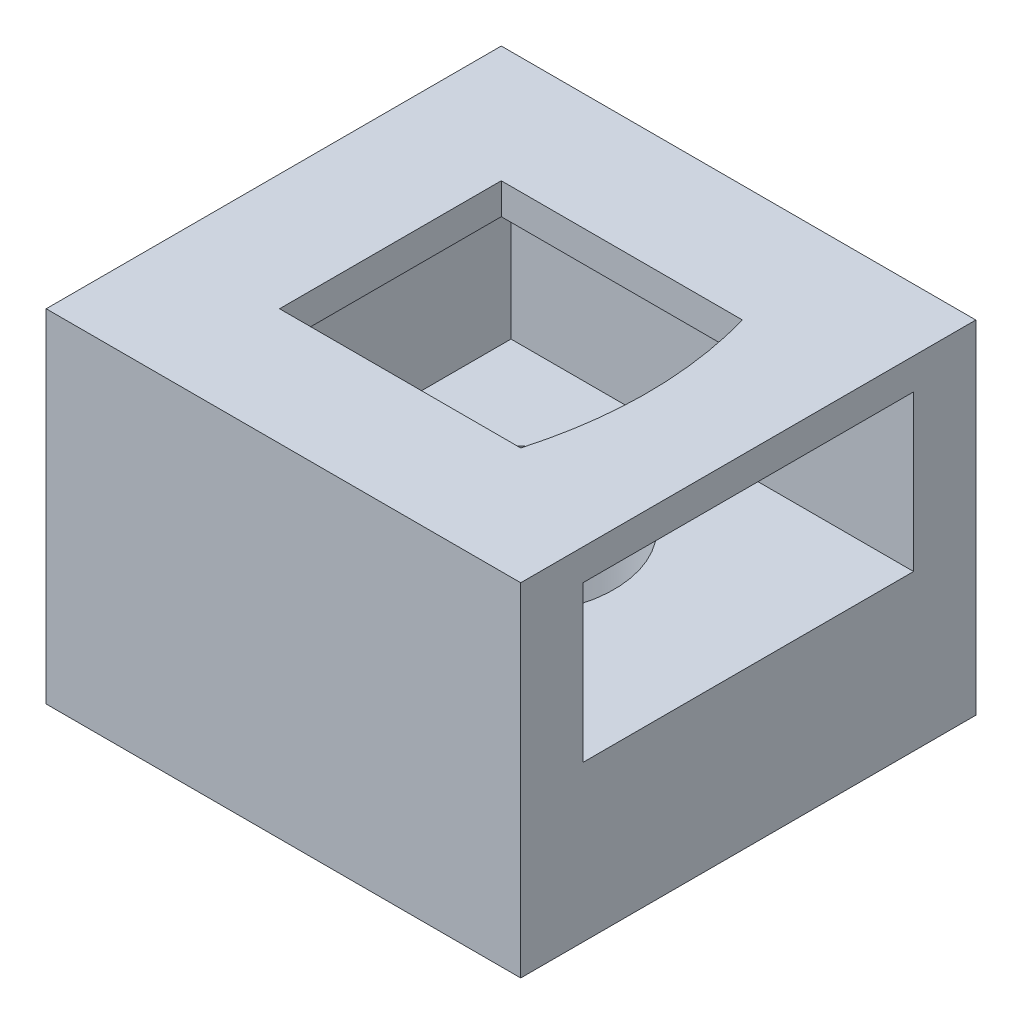
ISO-10303-21;
HEADER;
FILE_DESCRIPTION(('STEP AP214'),'2;1');
FILE_NAME('part.step','',(''),(''),'','','');
FILE_SCHEMA(('AUTOMOTIVE_DESIGN { 1 0 10303 214 1 1 1 1 }'));
ENDSEC;
DATA;
#1=APPLICATION_CONTEXT('core data for automotive mechanical design processes');
#2=APPLICATION_PROTOCOL_DEFINITION('international standard','automotive_design',2000,#1);
#3=PRODUCT_CONTEXT('',#1,'mechanical');
#4=PRODUCT('Part','Part','',(#3));
#5=PRODUCT_RELATED_PRODUCT_CATEGORY('part','',(#4));
#6=PRODUCT_DEFINITION_FORMATION('','',#4);
#7=PRODUCT_DEFINITION_CONTEXT('part definition',#1,'design');
#8=PRODUCT_DEFINITION('design','',#6,#7);
#9=PRODUCT_DEFINITION_SHAPE('','',#8);
#10=(LENGTH_UNIT() NAMED_UNIT(*) SI_UNIT(.MILLI.,.METRE.));
#11=(NAMED_UNIT(*) PLANE_ANGLE_UNIT() SI_UNIT($,.RADIAN.));
#12=(NAMED_UNIT(*) SI_UNIT($,.STERADIAN.) SOLID_ANGLE_UNIT());
#13=UNCERTAINTY_MEASURE_WITH_UNIT(LENGTH_MEASURE(1.E-05),#10,'distance_accuracy_value','');
#14=(GEOMETRIC_REPRESENTATION_CONTEXT(3) GLOBAL_UNCERTAINTY_ASSIGNED_CONTEXT((#13)) GLOBAL_UNIT_ASSIGNED_CONTEXT((#10,
#11,#12)) REPRESENTATION_CONTEXT('',''));
#15=CARTESIAN_POINT('',(0.,0.,0.));
#16=DIRECTION('',(0.,0.,1.));
#17=DIRECTION('',(1.,0.,0.));
#18=AXIS2_PLACEMENT_3D('',#15,#16,#17);
#19=CARTESIAN_POINT('',(0.,-0.8,-2.85));
#20=DIRECTION('',(0.,0.,1.));
#21=DIRECTION('',(1.,0.,0.));
#22=AXIS2_PLACEMENT_3D('',#19,#20,#21);
#23=PLANE('',#22);
#24=DIRECTION('',(1.,0.,0.));
#25=VECTOR('',#24,1.);
#26=CARTESIAN_POINT('',(0.,0.,-2.85));
#27=LINE('',#26,#25);
#28=CARTESIAN_POINT('',(-3.1,0.,-2.85));
#29=VERTEX_POINT('',#28);
#30=CARTESIAN_POINT('',(3.1,0.,-2.85));
#31=VERTEX_POINT('',#30);
#32=EDGE_CURVE('E174',#29,#31,#27,.T.);
#33=ORIENTED_EDGE('',*,*,#32,.F.);
#34=DIRECTION('',(0.,1.,0.));
#35=VECTOR('',#34,1.);
#36=CARTESIAN_POINT('',(-3.1,-0.8,-2.85));
#37=LINE('',#36,#35);
#38=CARTESIAN_POINT('',(-3.1,-0.8,-2.85));
#39=VERTEX_POINT('',#38);
#40=EDGE_CURVE('E179',#39,#29,#37,.T.);
#41=ORIENTED_EDGE('',*,*,#40,.F.);
#42=DIRECTION('',(1.,0.,0.));
#43=VECTOR('',#42,1.);
#44=CARTESIAN_POINT('',(0.,-0.8,-2.85));
#45=LINE('',#44,#43);
#46=CARTESIAN_POINT('',(3.1,-0.8,-2.85));
#47=VERTEX_POINT('',#46);
#48=EDGE_CURVE('E176',#39,#47,#45,.T.);
#49=ORIENTED_EDGE('',*,*,#48,.T.);
#50=DIRECTION('',(0.,1.,0.));
#51=VECTOR('',#50,1.);
#52=CARTESIAN_POINT('',(3.1,-0.8,-2.85));
#53=LINE('',#52,#51);
#54=EDGE_CURVE('E160',#47,#31,#53,.T.);
#55=ORIENTED_EDGE('',*,*,#54,.T.);
#56=EDGE_LOOP('',(#33,#41,#49,#55));
#57=FACE_BOUND('',#56,.T.);
#58=ADVANCED_FACE('F47',(#57),#23,.T.);
#59=CARTESIAN_POINT('',(-3.1,-0.8,0.));
#60=DIRECTION('',(1.,0.,0.));
#61=DIRECTION('',(0.,0.,-1.));
#62=AXIS2_PLACEMENT_3D('',#59,#60,#61);
#63=PLANE('',#62);
#64=DIRECTION('',(0.,0.,-1.));
#65=VECTOR('',#64,1.);
#66=CARTESIAN_POINT('',(-3.1,0.,0.));
#67=LINE('',#66,#65);
#68=CARTESIAN_POINT('',(-3.1,0.,2.85));
#69=VERTEX_POINT('',#68);
#70=EDGE_CURVE('E185',#69,#29,#67,.T.);
#71=ORIENTED_EDGE('',*,*,#70,.F.);
#72=DIRECTION('',(0.,1.,0.));
#73=VECTOR('',#72,1.);
#74=CARTESIAN_POINT('',(-3.1,-0.8,2.85));
#75=LINE('',#74,#73);
#76=CARTESIAN_POINT('',(-3.1,-0.8,2.85));
#77=VERTEX_POINT('',#76);
#78=EDGE_CURVE('E200',#77,#69,#75,.T.);
#79=ORIENTED_EDGE('',*,*,#78,.F.);
#80=DIRECTION('',(0.,0.,-1.));
#81=VECTOR('',#80,1.);
#82=CARTESIAN_POINT('',(-3.1,-0.8,0.));
#83=LINE('',#82,#81);
#84=EDGE_CURVE('E192',#77,#39,#83,.T.);
#85=ORIENTED_EDGE('',*,*,#84,.T.);
#86=ORIENTED_EDGE('',*,*,#40,.T.);
#87=EDGE_LOOP('',(#71,#79,#85,#86));
#88=FACE_BOUND('',#87,.T.);
#89=ADVANCED_FACE('F261',(#88),#63,.T.);
#90=CARTESIAN_POINT('',(6.1,-0.8,0.));
#91=DIRECTION('',(-1.,0.,0.));
#92=DIRECTION('',(0.,0.,1.));
#93=AXIS2_PLACEMENT_3D('',#90,#91,#92);
#94=PLANE('',#93);
#95=DIRECTION('',(0.,0.,-1.));
#96=VECTOR('',#95,1.);
#97=CARTESIAN_POINT('',(6.1,-0.8,0.));
#98=LINE('',#97,#96);
#99=CARTESIAN_POINT('',(6.1,-0.8,4.25));
#100=VERTEX_POINT('',#99);
#101=CARTESIAN_POINT('',(6.1,-0.8,-4.25));
#102=VERTEX_POINT('',#101);
#103=EDGE_CURVE('E57',#100,#102,#98,.T.);
#104=ORIENTED_EDGE('',*,*,#103,.T.);
#105=DIRECTION('',(0.,-1.,0.));
#106=VECTOR('',#105,1.);
#107=CARTESIAN_POINT('',(6.1,-0.800000000000001,-4.25));
#108=LINE('',#107,#106);
#109=CARTESIAN_POINT('',(6.1,-4.8,-4.25));
#110=VERTEX_POINT('',#109);
#111=EDGE_CURVE('E11',#102,#110,#108,.T.);
#112=ORIENTED_EDGE('',*,*,#111,.T.);
#113=DIRECTION('',(0.,0.,1.));
#114=VECTOR('',#113,1.);
#115=CARTESIAN_POINT('',(6.1,-4.8,0.));
#116=LINE('',#115,#114);
#117=CARTESIAN_POINT('',(6.1,-4.8,4.25));
#118=VERTEX_POINT('',#117);
#119=EDGE_CURVE('E178',#110,#118,#116,.T.);
#120=ORIENTED_EDGE('',*,*,#119,.T.);
#121=DIRECTION('',(0.,1.,0.));
#122=VECTOR('',#121,1.);
#123=CARTESIAN_POINT('',(6.1,-0.799999999999999,4.25));
#124=LINE('',#123,#122);
#125=EDGE_CURVE('E219',#118,#100,#124,.T.);
#126=ORIENTED_EDGE('',*,*,#125,.T.);
#127=EDGE_LOOP('',(#104,#112,#120,#126));
#128=FACE_BOUND('',#127,.T.);
#129=DIRECTION('',(0.,0.,1.));
#130=VECTOR('',#129,1.);
#131=CARTESIAN_POINT('',(6.1,0.,0.));
#132=LINE('',#131,#130);
#133=CARTESIAN_POINT('',(6.1,0.,-5.85));
#134=VERTEX_POINT('',#133);
#135=CARTESIAN_POINT('',(6.1,0.,5.85));
#136=VERTEX_POINT('',#135);
#137=EDGE_CURVE('E243',#134,#136,#132,.T.);
#138=ORIENTED_EDGE('',*,*,#137,.T.);
#139=DIRECTION('',(0.,1.,0.));
#140=VECTOR('',#139,1.);
#141=CARTESIAN_POINT('',(6.1,-0.8,5.85));
#142=LINE('',#141,#140);
#143=CARTESIAN_POINT('',(6.1,-8.8,5.85));
#144=VERTEX_POINT('',#143);
#145=EDGE_CURVE('E203',#144,#136,#142,.T.);
#146=ORIENTED_EDGE('',*,*,#145,.F.);
#147=DIRECTION('',(0.,0.,1.));
#148=VECTOR('',#147,1.);
#149=CARTESIAN_POINT('',(6.1,-8.8,5.85));
#150=LINE('',#149,#148);
#151=CARTESIAN_POINT('',(6.1,-8.8,-5.85));
#152=VERTEX_POINT('',#151);
#153=EDGE_CURVE('E313',#152,#144,#150,.T.);
#154=ORIENTED_EDGE('',*,*,#153,.F.);
#155=DIRECTION('',(0.,1.,0.));
#156=VECTOR('',#155,1.);
#157=CARTESIAN_POINT('',(6.1,-0.8,-5.85));
#158=LINE('',#157,#156);
#159=EDGE_CURVE('E212',#152,#134,#158,.T.);
#160=ORIENTED_EDGE('',*,*,#159,.T.);
#161=EDGE_LOOP('',(#138,#146,#154,#160));
#162=FACE_BOUND('',#161,.T.);
#163=ADVANCED_FACE('F49',(#128,#162),#94,.F.);
#164=CARTESIAN_POINT('',(0.,-0.8,5.85));
#165=DIRECTION('',(0.,0.,1.));
#166=DIRECTION('',(1.,0.,0.));
#167=AXIS2_PLACEMENT_3D('',#164,#165,#166);
#168=PLANE('',#167);
#169=DIRECTION('',(1.,0.,0.));
#170=VECTOR('',#169,1.);
#171=CARTESIAN_POINT('',(0.,0.,5.85));
#172=LINE('',#171,#170);
#173=CARTESIAN_POINT('',(-6.1,0.,5.85));
#174=VERTEX_POINT('',#173);
#175=EDGE_CURVE('E254',#174,#136,#172,.T.);
#176=ORIENTED_EDGE('',*,*,#175,.F.);
#177=DIRECTION('',(0.,1.,0.));
#178=VECTOR('',#177,1.);
#179=CARTESIAN_POINT('',(-6.1,-0.8,5.85));
#180=LINE('',#179,#178);
#181=CARTESIAN_POINT('',(-6.1,-8.8,5.85));
#182=VERTEX_POINT('',#181);
#183=EDGE_CURVE('E206',#182,#174,#180,.T.);
#184=ORIENTED_EDGE('',*,*,#183,.F.);
#185=DIRECTION('',(-1.,0.,0.));
#186=VECTOR('',#185,1.);
#187=CARTESIAN_POINT('',(-6.1,-8.8,5.85));
#188=LINE('',#187,#186);
#189=EDGE_CURVE('E320',#144,#182,#188,.T.);
#190=ORIENTED_EDGE('',*,*,#189,.F.);
#191=ORIENTED_EDGE('',*,*,#145,.T.);
#192=EDGE_LOOP('',(#176,#184,#190,#191));
#193=FACE_BOUND('',#192,.T.);
#194=ADVANCED_FACE('F393',(#193),#168,.T.);
#195=CARTESIAN_POINT('',(-6.1,-0.8,0.));
#196=DIRECTION('',(-1.,0.,0.));
#197=DIRECTION('',(0.,0.,1.));
#198=AXIS2_PLACEMENT_3D('',#195,#196,#197);
#199=PLANE('',#198);
#200=DIRECTION('',(0.,0.,1.));
#201=VECTOR('',#200,1.);
#202=CARTESIAN_POINT('',(-6.1,0.,0.));
#203=LINE('',#202,#201);
#204=CARTESIAN_POINT('',(-6.1,0.,-5.85));
#205=VERTEX_POINT('',#204);
#206=EDGE_CURVE('E250',#205,#174,#203,.T.);
#207=ORIENTED_EDGE('',*,*,#206,.F.);
#208=DIRECTION('',(0.,1.,0.));
#209=VECTOR('',#208,1.);
#210=CARTESIAN_POINT('',(-6.1,-0.8,-5.85));
#211=LINE('',#210,#209);
#212=CARTESIAN_POINT('',(-6.1,-15.02,-5.85));
#213=VERTEX_POINT('',#212);
#214=EDGE_CURVE('E209',#213,#205,#211,.T.);
#215=ORIENTED_EDGE('',*,*,#214,.F.);
#216=DIRECTION('',(0.,0.,-1.));
#217=VECTOR('',#216,1.);
#218=CARTESIAN_POINT('',(-6.1,-15.02,-5.85));
#219=LINE('',#218,#217);
#220=CARTESIAN_POINT('',(-6.1,-15.02,-3.35));
#221=VERTEX_POINT('',#220);
#222=EDGE_CURVE('E277',#221,#213,#219,.T.);
#223=ORIENTED_EDGE('',*,*,#222,.F.);
#224=DIRECTION('',(0.,1.,0.));
#225=VECTOR('',#224,1.);
#226=CARTESIAN_POINT('',(-6.1,-15.02,-3.35));
#227=LINE('',#226,#225);
#228=CARTESIAN_POINT('',(-6.1,-8.8,-3.35));
#229=VERTEX_POINT('',#228);
#230=EDGE_CURVE('E292',#221,#229,#227,.T.);
#231=ORIENTED_EDGE('',*,*,#230,.T.);
#232=DIRECTION('',(0.,0.,-1.));
#233=VECTOR('',#232,1.);
#234=CARTESIAN_POINT('',(-6.1,-8.8,5.85));
#235=LINE('',#234,#233);
#236=EDGE_CURVE('E324',#182,#229,#235,.T.);
#237=ORIENTED_EDGE('',*,*,#236,.F.);
#238=ORIENTED_EDGE('',*,*,#183,.T.);
#239=EDGE_LOOP('',(#207,#215,#223,#231,#237,#238));
#240=FACE_BOUND('',#239,.T.);
#241=ADVANCED_FACE('F396',(#240),#199,.T.);
#242=CARTESIAN_POINT('',(0.,-0.8,-5.85));
#243=DIRECTION('',(0.,0.,1.));
#244=DIRECTION('',(1.,0.,0.));
#245=AXIS2_PLACEMENT_3D('',#242,#243,#244);
#246=PLANE('',#245);
#247=DIRECTION('',(1.,0.,0.));
#248=VECTOR('',#247,1.);
#249=CARTESIAN_POINT('',(0.,0.,-5.85));
#250=LINE('',#249,#248);
#251=EDGE_CURVE('E247',#205,#134,#250,.T.);
#252=ORIENTED_EDGE('',*,*,#251,.T.);
#253=ORIENTED_EDGE('',*,*,#159,.F.);
#254=DIRECTION('',(1.,0.,0.));
#255=VECTOR('',#254,1.);
#256=CARTESIAN_POINT('',(-6.1,-8.8,-5.85));
#257=LINE('',#256,#255);
#258=CARTESIAN_POINT('',(-3.6,-8.8,-5.85));
#259=VERTEX_POINT('',#258);
#260=EDGE_CURVE('E327',#259,#152,#257,.T.);
#261=ORIENTED_EDGE('',*,*,#260,.F.);
#262=DIRECTION('',(0.,1.,0.));
#263=VECTOR('',#262,1.);
#264=CARTESIAN_POINT('',(-3.6,-15.02,-5.85));
#265=LINE('',#264,#263);
#266=CARTESIAN_POINT('',(-3.6,-15.02,-5.85));
#267=VERTEX_POINT('',#266);
#268=EDGE_CURVE('E304',#267,#259,#265,.T.);
#269=ORIENTED_EDGE('',*,*,#268,.F.);
#270=DIRECTION('',(1.,0.,0.));
#271=VECTOR('',#270,1.);
#272=CARTESIAN_POINT('',(-6.1,-15.02,-5.85));
#273=LINE('',#272,#271);
#274=EDGE_CURVE('E284',#213,#267,#273,.T.);
#275=ORIENTED_EDGE('',*,*,#274,.F.);
#276=ORIENTED_EDGE('',*,*,#214,.T.);
#277=EDGE_LOOP('',(#252,#253,#261,#269,#275,#276));
#278=FACE_BOUND('',#277,.T.);
#279=ADVANCED_FACE('F392',(#278),#246,.F.);
#280=CARTESIAN_POINT('',(0.,-0.8,2.85));
#281=DIRECTION('',(0.,0.,1.));
#282=DIRECTION('',(1.,0.,0.));
#283=AXIS2_PLACEMENT_3D('',#280,#281,#282);
#284=PLANE('',#283);
#285=DIRECTION('',(1.,0.,0.));
#286=VECTOR('',#285,1.);
#287=CARTESIAN_POINT('',(0.,0.,2.85));
#288=LINE('',#287,#286);
#289=CARTESIAN_POINT('',(3.1,0.,2.85));
#290=VERTEX_POINT('',#289);
#291=EDGE_CURVE('E194',#69,#290,#288,.T.);
#292=ORIENTED_EDGE('',*,*,#291,.T.);
#293=DIRECTION('',(0.,1.,0.));
#294=VECTOR('',#293,1.);
#295=CARTESIAN_POINT('',(3.1,-0.8,2.85));
#296=LINE('',#295,#294);
#297=CARTESIAN_POINT('',(3.1,-0.8,2.85));
#298=VERTEX_POINT('',#297);
#299=EDGE_CURVE('E163',#298,#290,#296,.T.);
#300=ORIENTED_EDGE('',*,*,#299,.F.);
#301=DIRECTION('',(1.,0.,0.));
#302=VECTOR('',#301,1.);
#303=CARTESIAN_POINT('',(0.,-0.8,2.85));
#304=LINE('',#303,#302);
#305=EDGE_CURVE('E187',#77,#298,#304,.T.);
#306=ORIENTED_EDGE('',*,*,#305,.F.);
#307=ORIENTED_EDGE('',*,*,#78,.T.);
#308=EDGE_LOOP('',(#292,#300,#306,#307));
#309=FACE_BOUND('',#308,.T.);
#310=ADVANCED_FACE('F259',(#309),#284,.F.);
#311=CARTESIAN_POINT('',(0.,-0.8,0.));
#312=DIRECTION('',(0.,1.,0.));
#313=DIRECTION('',(0.,0.,1.));
#314=AXIS2_PLACEMENT_3D('',#311,#312,#313);
#315=PLANE('',#314);
#316=DIRECTION('',(1.,0.,0.));
#317=VECTOR('',#316,1.);
#318=CARTESIAN_POINT('',(-4.25,-0.8,-4.25));
#319=LINE('',#318,#317);
#320=CARTESIAN_POINT('',(-4.25,-0.8,-4.25));
#321=VERTEX_POINT('',#320);
#322=EDGE_CURVE('E334',#321,#102,#319,.T.);
#323=ORIENTED_EDGE('',*,*,#322,.T.);
#324=ORIENTED_EDGE('',*,*,#103,.F.);
#325=DIRECTION('',(-1.,0.,0.));
#326=VECTOR('',#325,1.);
#327=CARTESIAN_POINT('',(-4.25,-0.8,4.25));
#328=LINE('',#327,#326);
#329=CARTESIAN_POINT('',(-4.25,-0.8,4.25));
#330=VERTEX_POINT('',#329);
#331=EDGE_CURVE('E330',#100,#330,#328,.T.);
#332=ORIENTED_EDGE('',*,*,#331,.T.);
#333=DIRECTION('',(0.,0.,-1.));
#334=VECTOR('',#333,1.);
#335=CARTESIAN_POINT('',(-4.25,-0.8,4.25));
#336=LINE('',#335,#334);
#337=EDGE_CURVE('E345',#330,#321,#336,.T.);
#338=ORIENTED_EDGE('',*,*,#337,.T.);
#339=EDGE_LOOP('',(#323,#324,#332,#338));
#340=FACE_BOUND('',#339,.T.);
#341=ORIENTED_EDGE('',*,*,#305,.T.);
#342=CARTESIAN_POINT('',(3.1,-0.8,2.85));
#343=CARTESIAN_POINT('',(3.9,-0.8,0.));
#344=CARTESIAN_POINT('',(3.1,-0.8,-2.85));
#345=B_SPLINE_CURVE_WITH_KNOTS('',2,(#342,#343,#344),.UNSPECIFIED.,.F.,.F.,(3,3),(0.,1.),.UNSPECIFIED.);
#346=EDGE_CURVE('E169',#298,#47,#345,.T.);
#347=ORIENTED_EDGE('',*,*,#346,.T.);
#348=ORIENTED_EDGE('',*,*,#48,.F.);
#349=ORIENTED_EDGE('',*,*,#84,.F.);
#350=EDGE_LOOP('',(#341,#347,#348,#349));
#351=FACE_BOUND('',#350,.T.);
#352=ADVANCED_FACE('F263',(#340,#351),#315,.F.);
#353=CARTESIAN_POINT('',(0.,0.,0.));
#354=DIRECTION('',(0.,1.,0.));
#355=DIRECTION('',(0.,0.,1.));
#356=AXIS2_PLACEMENT_3D('',#353,#354,#355);
#357=PLANE('',#356);
#358=CARTESIAN_POINT('',(3.1,0.,2.85));
#359=CARTESIAN_POINT('',(3.9,0.,0.));
#360=CARTESIAN_POINT('',(3.1,0.,-2.85));
#361=B_SPLINE_CURVE_WITH_KNOTS('',2,(#358,#359,#360),.UNSPECIFIED.,.F.,.F.,(3,3),(0.,1.),.UNSPECIFIED.);
#362=EDGE_CURVE('E157',#290,#31,#361,.T.);
#363=ORIENTED_EDGE('',*,*,#362,.F.);
#364=ORIENTED_EDGE('',*,*,#291,.F.);
#365=ORIENTED_EDGE('',*,*,#70,.T.);
#366=ORIENTED_EDGE('',*,*,#32,.T.);
#367=EDGE_LOOP('',(#363,#364,#365,#366));
#368=FACE_BOUND('',#367,.T.);
#369=ORIENTED_EDGE('',*,*,#137,.F.);
#370=ORIENTED_EDGE('',*,*,#251,.F.);
#371=ORIENTED_EDGE('',*,*,#206,.T.);
#372=ORIENTED_EDGE('',*,*,#175,.T.);
#373=EDGE_LOOP('',(#369,#370,#371,#372));
#374=FACE_BOUND('',#373,.T.);
#375=ADVANCED_FACE('F182',(#368,#374),#357,.T.);
#376=CARTESIAN_POINT('',(-4.25,-4.8,4.25));
#377=DIRECTION('',(0.,0.,-1.));
#378=DIRECTION('',(-1.,0.,0.));
#379=AXIS2_PLACEMENT_3D('',#376,#377,#378);
#380=PLANE('',#379);
#381=ORIENTED_EDGE('',*,*,#331,.F.);
#382=ORIENTED_EDGE('',*,*,#125,.F.);
#383=DIRECTION('',(-1.,0.,0.));
#384=VECTOR('',#383,1.);
#385=CARTESIAN_POINT('',(-4.25,-4.8,4.25));
#386=LINE('',#385,#384);
#387=CARTESIAN_POINT('',(-4.25,-4.8,4.25));
#388=VERTEX_POINT('',#387);
#389=EDGE_CURVE('E65',#118,#388,#386,.T.);
#390=ORIENTED_EDGE('',*,*,#389,.T.);
#391=DIRECTION('',(0.,1.,0.));
#392=VECTOR('',#391,1.);
#393=CARTESIAN_POINT('',(-4.25,-4.8,4.25));
#394=LINE('',#393,#392);
#395=EDGE_CURVE('E241',#388,#330,#394,.T.);
#396=ORIENTED_EDGE('',*,*,#395,.T.);
#397=EDGE_LOOP('',(#381,#382,#390,#396));
#398=FACE_BOUND('',#397,.T.);
#399=ADVANCED_FACE('F358',(#398),#380,.T.);
#400=CARTESIAN_POINT('',(-4.25,-4.8,4.25));
#401=DIRECTION('',(1.,0.,0.));
#402=DIRECTION('',(0.,0.,-1.));
#403=AXIS2_PLACEMENT_3D('',#400,#401,#402);
#404=PLANE('',#403);
#405=ORIENTED_EDGE('',*,*,#337,.F.);
#406=ORIENTED_EDGE('',*,*,#395,.F.);
#407=DIRECTION('',(0.,0.,-1.));
#408=VECTOR('',#407,1.);
#409=CARTESIAN_POINT('',(-4.25,-4.8,4.25));
#410=LINE('',#409,#408);
#411=CARTESIAN_POINT('',(-4.25,-4.8,-4.25));
#412=VERTEX_POINT('',#411);
#413=EDGE_CURVE('E333',#388,#412,#410,.T.);
#414=ORIENTED_EDGE('',*,*,#413,.T.);
#415=DIRECTION('',(0.,1.,0.));
#416=VECTOR('',#415,1.);
#417=CARTESIAN_POINT('',(-4.25,-4.8,-4.25));
#418=LINE('',#417,#416);
#419=EDGE_CURVE('E341',#412,#321,#418,.T.);
#420=ORIENTED_EDGE('',*,*,#419,.T.);
#421=EDGE_LOOP('',(#405,#406,#414,#420));
#422=FACE_BOUND('',#421,.T.);
#423=ADVANCED_FACE('F360',(#422),#404,.T.);
#424=CARTESIAN_POINT('',(-4.25,-4.8,-4.25));
#425=DIRECTION('',(0.,0.,1.));
#426=DIRECTION('',(1.,0.,0.));
#427=AXIS2_PLACEMENT_3D('',#424,#425,#426);
#428=PLANE('',#427);
#429=ORIENTED_EDGE('',*,*,#322,.F.);
#430=ORIENTED_EDGE('',*,*,#419,.F.);
#431=DIRECTION('',(1.,0.,0.));
#432=VECTOR('',#431,1.);
#433=CARTESIAN_POINT('',(-4.25,-4.8,-4.25));
#434=LINE('',#433,#432);
#435=EDGE_CURVE('E338',#412,#110,#434,.T.);
#436=ORIENTED_EDGE('',*,*,#435,.T.);
#437=ORIENTED_EDGE('',*,*,#111,.F.);
#438=EDGE_LOOP('',(#429,#430,#436,#437));
#439=FACE_BOUND('',#438,.T.);
#440=ADVANCED_FACE('F368',(#439),#428,.T.);
#441=CARTESIAN_POINT('',(0.,-8.8,0.));
#442=DIRECTION('',(0.,-1.,0.));
#443=DIRECTION('',(0.,0.,-1.));
#444=AXIS2_PLACEMENT_3D('',#441,#442,#443);
#445=PLANE('',#444);
#446=DIRECTION('',(-1.,0.,0.));
#447=VECTOR('',#446,1.);
#448=CARTESIAN_POINT('',(-6.1,-8.8,-3.35));
#449=LINE('',#448,#447);
#450=CARTESIAN_POINT('',(-3.6,-8.8,-3.35));
#451=VERTEX_POINT('',#450);
#452=EDGE_CURVE('E267',#451,#229,#449,.T.);
#453=ORIENTED_EDGE('',*,*,#452,.F.);
#454=DIRECTION('',(0.,0.,1.));
#455=VECTOR('',#454,1.);
#456=CARTESIAN_POINT('',(-3.6,-8.8,-5.85));
#457=LINE('',#456,#455);
#458=EDGE_CURVE('E73',#259,#451,#457,.T.);
#459=ORIENTED_EDGE('',*,*,#458,.F.);
#460=ORIENTED_EDGE('',*,*,#260,.T.);
#461=ORIENTED_EDGE('',*,*,#153,.T.);
#462=ORIENTED_EDGE('',*,*,#189,.T.);
#463=ORIENTED_EDGE('',*,*,#236,.T.);
#464=EDGE_LOOP('',(#453,#459,#460,#461,#462,#463));
#465=FACE_BOUND('',#464,.T.);
#466=CARTESIAN_POINT('',(0.,-8.8,0.));
#467=DIRECTION('',(0.,-1.,0.));
#468=DIRECTION('',(0.,0.,-1.));
#469=AXIS2_PLACEMENT_3D('',#466,#467,#468);
#470=CIRCLE('',#469,2.65);
#471=CARTESIAN_POINT('',(0.,-8.8,-2.65));
#472=VERTEX_POINT('',#471);
#473=EDGE_CURVE('E309',#472,#472,#470,.T.);
#474=ORIENTED_EDGE('',*,*,#473,.F.);
#475=EDGE_LOOP('',(#474));
#476=FACE_BOUND('',#475,.T.);
#477=ADVANCED_FACE('F370',(#465,#476),#445,.T.);
#478=CARTESIAN_POINT('',(0.,-4.8,0.));
#479=DIRECTION('',(0.,-1.,0.));
#480=DIRECTION('',(0.,0.,-1.));
#481=AXIS2_PLACEMENT_3D('',#478,#479,#480);
#482=PLANE('',#481);
#483=ORIENTED_EDGE('',*,*,#389,.F.);
#484=ORIENTED_EDGE('',*,*,#119,.F.);
#485=ORIENTED_EDGE('',*,*,#435,.F.);
#486=ORIENTED_EDGE('',*,*,#413,.F.);
#487=EDGE_LOOP('',(#483,#484,#485,#486));
#488=FACE_BOUND('',#487,.T.);
#489=CARTESIAN_POINT('',(0.,-4.8,0.));
#490=DIRECTION('',(0.,-1.,0.));
#491=DIRECTION('',(0.,0.,-1.));
#492=AXIS2_PLACEMENT_3D('',#489,#490,#491);
#493=CIRCLE('',#492,2.65);
#494=CARTESIAN_POINT('',(0.,-4.8,-2.65));
#495=VERTEX_POINT('',#494);
#496=EDGE_CURVE('E308',#495,#495,#493,.T.);
#497=ORIENTED_EDGE('',*,*,#496,.T.);
#498=EDGE_LOOP('',(#497));
#499=FACE_BOUND('',#498,.T.);
#500=ADVANCED_FACE('F365',(#488,#499),#482,.F.);
#501=CARTESIAN_POINT('',(0.,-8.8,0.));
#502=DIRECTION('',(0.,1.,0.));
#503=DIRECTION('',(0.,0.,1.));
#504=AXIS2_PLACEMENT_3D('',#501,#502,#503);
#505=CYLINDRICAL_SURFACE('',#504,2.65);
#506=ORIENTED_EDGE('',*,*,#473,.T.);
#507=EDGE_LOOP('',(#506));
#508=FACE_BOUND('',#507,.T.);
#509=ORIENTED_EDGE('',*,*,#496,.F.);
#510=EDGE_LOOP('',(#509));
#511=FACE_BOUND('',#510,.T.);
#512=ADVANCED_FACE('F433',(#508,#511),#505,.F.);
#513=CARTESIAN_POINT('',(-3.6,-15.02,-5.85));
#514=DIRECTION('',(-1.,0.,0.));
#515=DIRECTION('',(0.,0.,1.));
#516=AXIS2_PLACEMENT_3D('',#513,#514,#515);
#517=PLANE('',#516);
#518=ORIENTED_EDGE('',*,*,#458,.T.);
#519=DIRECTION('',(0.,1.,0.));
#520=VECTOR('',#519,1.);
#521=CARTESIAN_POINT('',(-3.6,-15.02,-3.35));
#522=LINE('',#521,#520);
#523=CARTESIAN_POINT('',(-3.6,-15.02,-3.35));
#524=VERTEX_POINT('',#523);
#525=EDGE_CURVE('E300',#524,#451,#522,.T.);
#526=ORIENTED_EDGE('',*,*,#525,.F.);
#527=DIRECTION('',(0.,0.,1.));
#528=VECTOR('',#527,1.);
#529=CARTESIAN_POINT('',(-3.6,-15.02,-5.85));
#530=LINE('',#529,#528);
#531=EDGE_CURVE('E287',#267,#524,#530,.T.);
#532=ORIENTED_EDGE('',*,*,#531,.F.);
#533=ORIENTED_EDGE('',*,*,#268,.T.);
#534=EDGE_LOOP('',(#518,#526,#532,#533));
#535=FACE_BOUND('',#534,.T.);
#536=ADVANCED_FACE('F417',(#535),#517,.F.);
#537=CARTESIAN_POINT('',(-6.1,-15.02,-3.35));
#538=DIRECTION('',(0.,0.,-1.));
#539=DIRECTION('',(-1.,0.,0.));
#540=AXIS2_PLACEMENT_3D('',#537,#538,#539);
#541=PLANE('',#540);
#542=ORIENTED_EDGE('',*,*,#452,.T.);
#543=ORIENTED_EDGE('',*,*,#230,.F.);
#544=DIRECTION('',(-1.,0.,0.));
#545=VECTOR('',#544,1.);
#546=CARTESIAN_POINT('',(-6.1,-15.02,-3.35));
#547=LINE('',#546,#545);
#548=EDGE_CURVE('E290',#524,#221,#547,.T.);
#549=ORIENTED_EDGE('',*,*,#548,.F.);
#550=ORIENTED_EDGE('',*,*,#525,.T.);
#551=EDGE_LOOP('',(#542,#543,#549,#550));
#552=FACE_BOUND('',#551,.T.);
#553=ADVANCED_FACE('F425',(#552),#541,.F.);
#554=CARTESIAN_POINT('',(0.,-15.02,0.));
#555=DIRECTION('',(0.,1.,0.));
#556=DIRECTION('',(0.,0.,1.));
#557=AXIS2_PLACEMENT_3D('',#554,#555,#556);
#558=PLANE('',#557);
#559=ORIENTED_EDGE('',*,*,#222,.T.);
#560=ORIENTED_EDGE('',*,*,#274,.T.);
#561=ORIENTED_EDGE('',*,*,#531,.T.);
#562=ORIENTED_EDGE('',*,*,#548,.T.);
#563=EDGE_LOOP('',(#559,#560,#561,#562));
#564=FACE_BOUND('',#563,.T.);
#565=ADVANCED_FACE('F421',(#564),#558,.F.);
#566=CARTESIAN_POINT('',(3.1,-2.,2.85));
#567=CARTESIAN_POINT('',(3.9,-2.,0.));
#568=CARTESIAN_POINT('',(3.1,-2.,-2.85));
#569=B_SPLINE_CURVE_WITH_KNOTS('',2,(#566,#567,#568),.UNSPECIFIED.,.F.,.F.,(3,3),(0.,1.),.UNSPECIFIED.);
#570=DIRECTION('',(0.,1.,0.));
#571=VECTOR('',#570,1.);
#572=SURFACE_OF_LINEAR_EXTRUSION('',#569,#571);
#573=ORIENTED_EDGE('',*,*,#299,.T.);
#574=ORIENTED_EDGE('',*,*,#362,.T.);
#575=ORIENTED_EDGE('',*,*,#54,.F.);
#576=ORIENTED_EDGE('',*,*,#346,.F.);
#577=EDGE_LOOP('',(#573,#574,#575,#576));
#578=FACE_BOUND('',#577,.T.);
#579=ADVANCED_FACE('F159',(#578),#572,.F.);
#580=CLOSED_SHELL('',(#58,#89,#163,#194,#241,#279,#310,#352,#375,#399,#423,#440,#477,#500,#512,
#536,#553,#565,#579));
#581=MANIFOLD_SOLID_BREP('B2',#580);
#582=ADVANCED_BREP_SHAPE_REPRESENTATION('',(#18,#581),#14);
#583=SHAPE_DEFINITION_REPRESENTATION(#9,#582);
ENDSEC;
END-ISO-10303-21;
